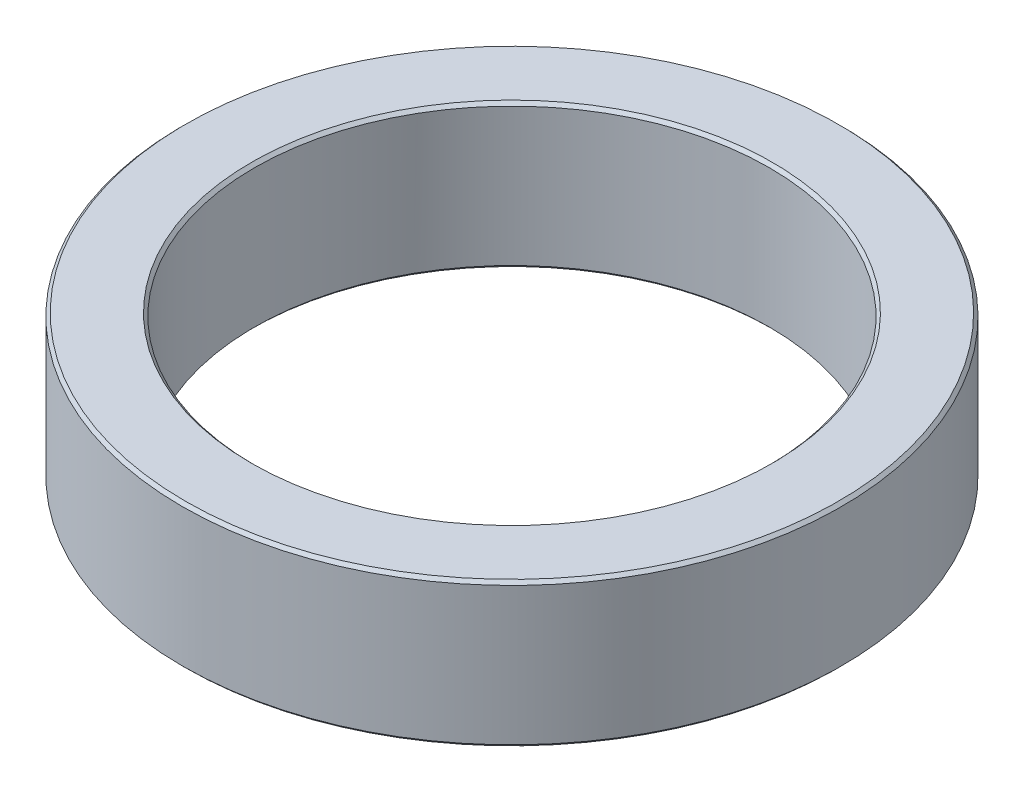
ISO-10303-21;
HEADER;
FILE_DESCRIPTION(('STEP AP214'),'2;1');
FILE_NAME('part.step','',(''),(''),'','','');
FILE_SCHEMA(('AUTOMOTIVE_DESIGN { 1 0 10303 214 1 1 1 1 }'));
ENDSEC;
DATA;
#1=APPLICATION_CONTEXT('core data for automotive mechanical design processes');
#2=APPLICATION_PROTOCOL_DEFINITION('international standard','automotive_design',2000,#1);
#3=PRODUCT_CONTEXT('',#1,'mechanical');
#4=PRODUCT('Part','Part','',(#3));
#5=PRODUCT_RELATED_PRODUCT_CATEGORY('part','',(#4));
#6=PRODUCT_DEFINITION_FORMATION('','',#4);
#7=PRODUCT_DEFINITION_CONTEXT('part definition',#1,'design');
#8=PRODUCT_DEFINITION('design','',#6,#7);
#9=PRODUCT_DEFINITION_SHAPE('','',#8);
#10=(LENGTH_UNIT() NAMED_UNIT(*) SI_UNIT(.MILLI.,.METRE.));
#11=(NAMED_UNIT(*) PLANE_ANGLE_UNIT() SI_UNIT($,.RADIAN.));
#12=(NAMED_UNIT(*) SI_UNIT($,.STERADIAN.) SOLID_ANGLE_UNIT());
#13=UNCERTAINTY_MEASURE_WITH_UNIT(LENGTH_MEASURE(1.E-05),#10,'distance_accuracy_value','');
#14=(GEOMETRIC_REPRESENTATION_CONTEXT(3) GLOBAL_UNCERTAINTY_ASSIGNED_CONTEXT((#13)) GLOBAL_UNIT_ASSIGNED_CONTEXT((#10,
#11,#12)) REPRESENTATION_CONTEXT('',''));
#15=CARTESIAN_POINT('',(0.,0.,0.));
#16=DIRECTION('',(0.,0.,1.));
#17=DIRECTION('',(1.,0.,0.));
#18=AXIS2_PLACEMENT_3D('',#15,#16,#17);
#19=CARTESIAN_POINT('',(0.,7.,0.));
#20=DIRECTION('',(0.,1.,0.));
#21=DIRECTION('',(0.,0.,1.));
#22=AXIS2_PLACEMENT_3D('',#19,#20,#21);
#23=PLANE('',#22);
#24=CARTESIAN_POINT('',(0.,7.,0.));
#25=DIRECTION('',(0.,1.,0.));
#26=DIRECTION('',(0.,0.,1.));
#27=AXIS2_PLACEMENT_3D('',#24,#25,#26);
#28=CIRCLE('',#27,12.65);
#29=CARTESIAN_POINT('',(0.,7.,12.65));
#30=VERTEX_POINT('',#29);
#31=EDGE_CURVE('E54',#30,#30,#28,.F.);
#32=ORIENTED_EDGE('',*,*,#31,.T.);
#33=EDGE_LOOP('',(#32));
#34=FACE_BOUND('',#33,.T.);
#35=CARTESIAN_POINT('',(0.,7.,0.));
#36=DIRECTION('',(0.,1.,0.));
#37=DIRECTION('',(0.,0.,1.));
#38=AXIS2_PLACEMENT_3D('',#35,#36,#37);
#39=CIRCLE('',#38,15.85);
#40=CARTESIAN_POINT('',(0.,7.,15.85));
#41=VERTEX_POINT('',#40);
#42=EDGE_CURVE('E57',#41,#41,#39,.T.);
#43=ORIENTED_EDGE('',*,*,#42,.T.);
#44=EDGE_LOOP('',(#43));
#45=FACE_BOUND('',#44,.T.);
#46=ADVANCED_FACE('F33',(#34,#45),#23,.T.);
#47=CARTESIAN_POINT('',(0.,0.,0.));
#48=DIRECTION('',(0.,1.,0.));
#49=DIRECTION('',(0.,0.,1.));
#50=AXIS2_PLACEMENT_3D('',#47,#48,#49);
#51=PLANE('',#50);
#52=CARTESIAN_POINT('',(0.,0.,0.));
#53=DIRECTION('',(0.,1.,0.));
#54=DIRECTION('',(0.,0.,1.));
#55=AXIS2_PLACEMENT_3D('',#52,#53,#54);
#56=CIRCLE('',#55,12.65);
#57=CARTESIAN_POINT('',(0.,0.,-12.65));
#58=VERTEX_POINT('',#57);
#59=EDGE_CURVE('E45',#58,#58,#56,.T.);
#60=ORIENTED_EDGE('',*,*,#59,.T.);
#61=EDGE_LOOP('',(#60));
#62=FACE_BOUND('',#61,.T.);
#63=CARTESIAN_POINT('',(0.,0.,0.));
#64=DIRECTION('',(0.,1.,0.));
#65=DIRECTION('',(0.,0.,1.));
#66=AXIS2_PLACEMENT_3D('',#63,#64,#65);
#67=CIRCLE('',#66,15.85);
#68=CARTESIAN_POINT('',(0.,0.,15.85));
#69=VERTEX_POINT('',#68);
#70=EDGE_CURVE('E49',#69,#69,#67,.F.);
#71=ORIENTED_EDGE('',*,*,#70,.T.);
#72=EDGE_LOOP('',(#71));
#73=FACE_BOUND('',#72,.T.);
#74=ADVANCED_FACE('F77',(#62,#73),#51,.F.);
#75=CARTESIAN_POINT('',(0.,7.,0.));
#76=DIRECTION('',(0.,-1.,0.));
#77=DIRECTION('',(0.,0.,-1.));
#78=AXIS2_PLACEMENT_3D('',#75,#76,#77);
#79=CYLINDRICAL_SURFACE('',#78,16.);
#80=CARTESIAN_POINT('',(0.,0.150000000000004,0.));
#81=DIRECTION('',(0.,1.,0.));
#82=DIRECTION('',(0.,0.,1.));
#83=AXIS2_PLACEMENT_3D('',#80,#81,#82);
#84=CIRCLE('',#83,16.);
#85=CARTESIAN_POINT('',(0.,0.150000000000004,16.));
#86=VERTEX_POINT('',#85);
#87=EDGE_CURVE('E10',#86,#86,#84,.T.);
#88=ORIENTED_EDGE('',*,*,#87,.T.);
#89=EDGE_LOOP('',(#88));
#90=FACE_BOUND('',#89,.T.);
#91=CARTESIAN_POINT('',(0.,6.85,0.));
#92=DIRECTION('',(0.,1.,0.));
#93=DIRECTION('',(0.,0.,1.));
#94=AXIS2_PLACEMENT_3D('',#91,#92,#93);
#95=CIRCLE('',#94,16.);
#96=CARTESIAN_POINT('',(0.,6.85,16.));
#97=VERTEX_POINT('',#96);
#98=EDGE_CURVE('E41',#97,#97,#95,.F.);
#99=ORIENTED_EDGE('',*,*,#98,.T.);
#100=EDGE_LOOP('',(#99));
#101=FACE_BOUND('',#100,.T.);
#102=ADVANCED_FACE('F80',(#90,#101),#79,.T.);
#103=CARTESIAN_POINT('',(0.,7.,0.));
#104=DIRECTION('',(0.,-1.,0.));
#105=DIRECTION('',(0.,0.,-1.));
#106=AXIS2_PLACEMENT_3D('',#103,#104,#105);
#107=CYLINDRICAL_SURFACE('',#106,12.5);
#108=CARTESIAN_POINT('',(0.,6.85000000000001,0.));
#109=DIRECTION('',(0.,1.,0.));
#110=DIRECTION('',(0.,0.,1.));
#111=AXIS2_PLACEMENT_3D('',#108,#109,#110);
#112=CIRCLE('',#111,12.5);
#113=CARTESIAN_POINT('',(0.,6.85000000000001,12.5));
#114=VERTEX_POINT('',#113);
#115=EDGE_CURVE('E60',#114,#114,#112,.T.);
#116=ORIENTED_EDGE('',*,*,#115,.T.);
#117=EDGE_LOOP('',(#116));
#118=FACE_BOUND('',#117,.T.);
#119=CARTESIAN_POINT('',(0.,0.150000000000003,0.));
#120=DIRECTION('',(0.,1.,0.));
#121=DIRECTION('',(0.,0.,1.));
#122=AXIS2_PLACEMENT_3D('',#119,#120,#121);
#123=CIRCLE('',#122,12.5);
#124=CARTESIAN_POINT('',(0.,0.150000000000003,-12.5));
#125=VERTEX_POINT('',#124);
#126=EDGE_CURVE('E63',#125,#125,#123,.F.);
#127=ORIENTED_EDGE('',*,*,#126,.T.);
#128=EDGE_LOOP('',(#127));
#129=FACE_BOUND('',#128,.T.);
#130=ADVANCED_FACE('F67',(#118,#129),#107,.F.);
#131=CARTESIAN_POINT('',(0.,6.85000000000001,0.));
#132=DIRECTION('',(0.,1.,0.));
#133=DIRECTION('',(0.,0.,1.));
#134=AXIS2_PLACEMENT_3D('',#131,#132,#133);
#135=CONICAL_SURFACE('',#134,12.5,0.785398163397454);
#136=ORIENTED_EDGE('',*,*,#31,.F.);
#137=EDGE_LOOP('',(#136));
#138=FACE_BOUND('',#137,.T.);
#139=ORIENTED_EDGE('',*,*,#115,.F.);
#140=EDGE_LOOP('',(#139));
#141=FACE_BOUND('',#140,.T.);
#142=ADVANCED_FACE('F73',(#138,#141),#135,.F.);
#143=CARTESIAN_POINT('',(0.,0.,0.));
#144=DIRECTION('',(0.,-1.,0.));
#145=DIRECTION('',(0.,0.,-1.));
#146=AXIS2_PLACEMENT_3D('',#143,#144,#145);
#147=CONICAL_SURFACE('',#146,12.65,0.785398163397443);
#148=CARTESIAN_POINT('',(0.,0.150000000000003,-12.5));
#149=CARTESIAN_POINT('',(0.,0.148437500000002,-12.5015625));
#150=CARTESIAN_POINT('',(0.,0.146875000000002,-12.503125));
#151=CARTESIAN_POINT('',(0.,0.143750000000002,-12.50625));
#152=CARTESIAN_POINT('',(0.,0.142187500000003,-12.5078125));
#153=CARTESIAN_POINT('',(0.,0.139062500000003,-12.5109375));
#154=CARTESIAN_POINT('',(0.,0.137500000000002,-12.5125));
#155=CARTESIAN_POINT('',(0.,0.134375000000002,-12.515625));
#156=CARTESIAN_POINT('',(0.,0.132812500000002,-12.5171875));
#157=CARTESIAN_POINT('',(0.,0.129687500000002,-12.5203125));
#158=CARTESIAN_POINT('',(0.,0.128125000000002,-12.521875));
#159=CARTESIAN_POINT('',(0.,0.125000000000002,-12.525));
#160=CARTESIAN_POINT('',(0.,0.123437500000002,-12.5265625));
#161=CARTESIAN_POINT('',(0.,0.120312500000002,-12.5296875));
#162=CARTESIAN_POINT('',(0.,0.118750000000002,-12.53125));
#163=CARTESIAN_POINT('',(0.,0.115625000000002,-12.534375));
#164=CARTESIAN_POINT('',(0.,0.114062500000002,-12.5359375));
#165=CARTESIAN_POINT('',(0.,0.110937500000002,-12.5390625));
#166=CARTESIAN_POINT('',(0.,0.109375000000002,-12.540625));
#167=CARTESIAN_POINT('',(0.,0.106250000000002,-12.54375));
#168=CARTESIAN_POINT('',(0.,0.104687500000002,-12.5453125));
#169=CARTESIAN_POINT('',(0.,0.101562500000002,-12.5484375));
#170=CARTESIAN_POINT('',(0.,0.100000000000002,-12.55));
#171=CARTESIAN_POINT('',(0.,0.0968750000000015,-12.553125));
#172=CARTESIAN_POINT('',(0.,0.0953125000000017,-12.5546875));
#173=CARTESIAN_POINT('',(0.,0.0921875000000018,-12.5578125));
#174=CARTESIAN_POINT('',(0.,0.0906250000000016,-12.559375));
#175=CARTESIAN_POINT('',(0.,0.0875000000000014,-12.5625));
#176=CARTESIAN_POINT('',(0.,0.0859375000000012,-12.5640625));
#177=CARTESIAN_POINT('',(0.,0.0828125000000013,-12.5671875));
#178=CARTESIAN_POINT('',(0.,0.0812500000000015,-12.56875));
#179=CARTESIAN_POINT('',(0.,0.0781250000000015,-12.571875));
#180=CARTESIAN_POINT('',(0.,0.0765625000000014,-12.5734375));
#181=CARTESIAN_POINT('',(0.,0.0734375000000011,-12.5765625));
#182=CARTESIAN_POINT('',(0.,0.071875000000001,-12.578125));
#183=CARTESIAN_POINT('',(0.,0.0687500000000011,-12.58125));
#184=CARTESIAN_POINT('',(0.,0.0671875000000012,-12.5828125));
#185=CARTESIAN_POINT('',(0.,0.0640625000000013,-12.5859375));
#186=CARTESIAN_POINT('',(0.,0.0625000000000012,-12.5875));
#187=CARTESIAN_POINT('',(0.,0.0593750000000009,-12.590625));
#188=CARTESIAN_POINT('',(0.,0.0578125000000008,-12.5921875));
#189=CARTESIAN_POINT('',(0.,0.0546875000000008,-12.5953125));
#190=CARTESIAN_POINT('',(0.,0.053125000000001,-12.596875));
#191=CARTESIAN_POINT('',(0.,0.050000000000001,-12.6));
#192=CARTESIAN_POINT('',(0.,0.0484375000000009,-12.6015625));
#193=CARTESIAN_POINT('',(0.,0.0453125000000007,-12.6046875));
#194=CARTESIAN_POINT('',(0.,0.0437500000000005,-12.60625));
#195=CARTESIAN_POINT('',(0.,0.0406250000000006,-12.609375));
#196=CARTESIAN_POINT('',(0.,0.0390625000000008,-12.6109375));
#197=CARTESIAN_POINT('',(0.,0.0359375000000008,-12.6140625));
#198=CARTESIAN_POINT('',(0.,0.0343750000000006,-12.615625));
#199=CARTESIAN_POINT('',(0.,0.0312500000000005,-12.61875));
#200=CARTESIAN_POINT('',(0.,0.0296875000000005,-12.6203125));
#201=CARTESIAN_POINT('',(0.,0.0265625000000004,-12.6234375));
#202=CARTESIAN_POINT('',(0.,0.0250000000000002,-12.625));
#203=CARTESIAN_POINT('',(0.,0.0218750000000003,-12.628125));
#204=CARTESIAN_POINT('',(0.,0.0203125000000004,-12.6296875));
#205=CARTESIAN_POINT('',(0.,0.0171875000000005,-12.6328125));
#206=CARTESIAN_POINT('',(0.,0.0156250000000004,-12.634375));
#207=CARTESIAN_POINT('',(0.,0.0125000000000001,-12.6375));
#208=CARTESIAN_POINT('',(0.,0.0109375,-12.6390625));
#209=CARTESIAN_POINT('',(0.,0.00781250000000001,-12.6421875));
#210=CARTESIAN_POINT('',(0.,0.00625000000000012,-12.64375));
#211=CARTESIAN_POINT('',(0.,0.00312500000000033,-12.646875));
#212=CARTESIAN_POINT('',(0.,0.00156250000000044,-12.6484375));
#213=CARTESIAN_POINT('',(0.,0.,-12.65));
#214=B_SPLINE_CURVE_WITH_KNOTS('',3,(#148,#149,#150,#151,#152,#153,#154,#155,#156,#157,#158,
#159,#160,#161,#162,#163,#164,#165,#166,#167,#168,#169,#170,#171,#172,#173,#174,#175,#176,#177,
#178,#179,#180,#181,#182,#183,#184,#185,#186,#187,#188,#189,#190,#191,#192,#193,#194,#195,#196,
#197,#198,#199,#200,#201,#202,#203,#204,#205,#206,#207,#208,#209,#210,#211,#212,#213),
.UNSPECIFIED.,.F.,.F.,(4,2,2,2,2,2,2,2,2,2,2,2,2,2,2,2,2,2,2,2,2,2,2,2,2,2,2,2,2,2,2,2,4),(0.,
0.00662912607362357,0.0132582521472484,0.0198873782208719,0.0265165042944955,0.0331456303681203,
0.0397747564417439,0.0464038825153675,0.0530330085889923,0.0596621346626158,0.0662912607362394,
0.072920386809863,0.0795495128834878,0.0861786389571114,0.092807765030735,0.0994368911043598,
0.106066017177983,0.112695143251607,0.119324269325232,0.125953395398855,0.132582521472479,
0.139211647546104,0.145840773619727,0.152469899693351,0.159099025766976,0.165728151840599,
0.172357277914223,0.178986403987846,0.185615530061471,0.192244656135095,0.198873782208718,
0.205502908282343,0.212132034355967),.UNSPECIFIED.);
#215=EDGE_CURVE('BSEAM69',#125,#58,#214,.T.);
#216=ORIENTED_EDGE('',*,*,#126,.F.);
#217=ORIENTED_EDGE('',*,*,#59,.F.);
#218=ORIENTED_EDGE('',*,*,#215,.T.);
#219=ORIENTED_EDGE('',*,*,#215,.F.);
#220=EDGE_LOOP('',(#216,#218,#217,#219));
#221=FACE_BOUND('',#220,.T.);
#222=ADVANCED_FACE('F69',(#221),#147,.F.);
#223=CARTESIAN_POINT('',(0.,0.150000000000004,0.));
#224=DIRECTION('',(0.,1.,0.));
#225=DIRECTION('',(0.,0.,1.));
#226=AXIS2_PLACEMENT_3D('',#223,#224,#225);
#227=CONICAL_SURFACE('',#226,16.,0.78539816339746);
#228=ORIENTED_EDGE('',*,*,#70,.F.);
#229=EDGE_LOOP('',(#228));
#230=FACE_BOUND('',#229,.T.);
#231=ORIENTED_EDGE('',*,*,#87,.F.);
#232=EDGE_LOOP('',(#231));
#233=FACE_BOUND('',#232,.T.);
#234=ADVANCED_FACE('F72',(#230,#233),#227,.T.);
#235=CARTESIAN_POINT('',(0.,7.,0.));
#236=DIRECTION('',(0.,-1.,0.));
#237=DIRECTION('',(0.,0.,-1.));
#238=AXIS2_PLACEMENT_3D('',#235,#236,#237);
#239=CONICAL_SURFACE('',#238,15.85,0.785398163397448);
#240=ORIENTED_EDGE('',*,*,#98,.F.);
#241=EDGE_LOOP('',(#240));
#242=FACE_BOUND('',#241,.T.);
#243=ORIENTED_EDGE('',*,*,#42,.F.);
#244=EDGE_LOOP('',(#243));
#245=FACE_BOUND('',#244,.T.);
#246=ADVANCED_FACE('F36',(#242,#245),#239,.T.);
#247=CLOSED_SHELL('',(#46,#74,#102,#130,#142,#222,#234,#246));
#248=MANIFOLD_SOLID_BREP('B2',#247);
#249=ADVANCED_BREP_SHAPE_REPRESENTATION('',(#18,#248),#14);
#250=SHAPE_DEFINITION_REPRESENTATION(#9,#249);
ENDSEC;
END-ISO-10303-21;
